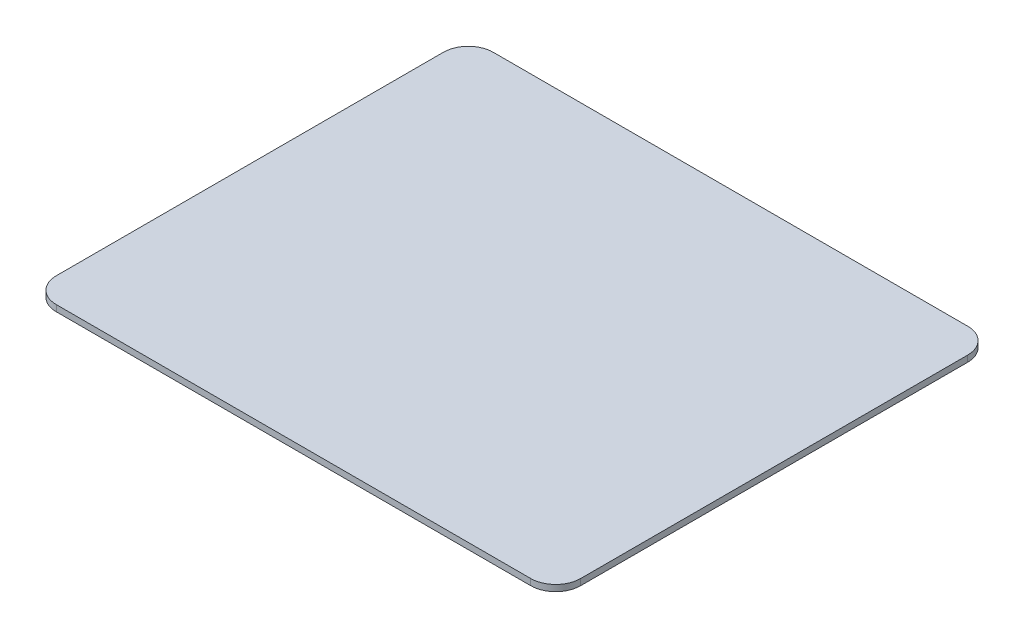
ISO-10303-21;
HEADER;
FILE_DESCRIPTION(('STEP AP214'),'2;1');
FILE_NAME('part.step','',(''),(''),'','','');
FILE_SCHEMA(('AUTOMOTIVE_DESIGN { 1 0 10303 214 1 1 1 1 }'));
ENDSEC;
DATA;
#1=APPLICATION_CONTEXT('core data for automotive mechanical design processes');
#2=APPLICATION_PROTOCOL_DEFINITION('international standard','automotive_design',2000,#1);
#3=PRODUCT_CONTEXT('',#1,'mechanical');
#4=PRODUCT('Part','Part','',(#3));
#5=PRODUCT_RELATED_PRODUCT_CATEGORY('part','',(#4));
#6=PRODUCT_DEFINITION_FORMATION('','',#4);
#7=PRODUCT_DEFINITION_CONTEXT('part definition',#1,'design');
#8=PRODUCT_DEFINITION('design','',#6,#7);
#9=PRODUCT_DEFINITION_SHAPE('','',#8);
#10=(LENGTH_UNIT() NAMED_UNIT(*) SI_UNIT(.MILLI.,.METRE.));
#11=(NAMED_UNIT(*) PLANE_ANGLE_UNIT() SI_UNIT($,.RADIAN.));
#12=(NAMED_UNIT(*) SI_UNIT($,.STERADIAN.) SOLID_ANGLE_UNIT());
#13=UNCERTAINTY_MEASURE_WITH_UNIT(LENGTH_MEASURE(1.E-05),#10,'distance_accuracy_value','');
#14=(GEOMETRIC_REPRESENTATION_CONTEXT(3) GLOBAL_UNCERTAINTY_ASSIGNED_CONTEXT((#13)) GLOBAL_UNIT_ASSIGNED_CONTEXT((#10,
#11,#12)) REPRESENTATION_CONTEXT('',''));
#15=CARTESIAN_POINT('',(0.,0.,0.));
#16=DIRECTION('',(0.,0.,1.));
#17=DIRECTION('',(1.,0.,0.));
#18=AXIS2_PLACEMENT_3D('',#15,#16,#17);
#19=CARTESIAN_POINT('',(210.,5.,175.));
#20=DIRECTION('',(-1.,0.,0.));
#21=DIRECTION('',(0.,0.,1.));
#22=AXIS2_PLACEMENT_3D('',#19,#20,#21);
#23=PLANE('',#22);
#24=DIRECTION('',(0.,0.,-1.));
#25=VECTOR('',#24,1.);
#26=CARTESIAN_POINT('',(210.,5.,175.));
#27=LINE('',#26,#25);
#28=CARTESIAN_POINT('',(210.,5.,155.));
#29=VERTEX_POINT('',#28);
#30=CARTESIAN_POINT('',(210.,5.,-155.));
#31=VERTEX_POINT('',#30);
#32=EDGE_CURVE('E122',#29,#31,#27,.T.);
#33=ORIENTED_EDGE('',*,*,#32,.F.);
#34=DIRECTION('',(0.,-1.,0.));
#35=VECTOR('',#34,1.);
#36=CARTESIAN_POINT('',(210.,5.,155.));
#37=LINE('',#36,#35);
#38=CARTESIAN_POINT('',(210.,0.,155.));
#39=VERTEX_POINT('',#38);
#40=EDGE_CURVE('E107',#29,#39,#37,.T.);
#41=ORIENTED_EDGE('',*,*,#40,.T.);
#42=DIRECTION('',(0.,0.,-1.));
#43=VECTOR('',#42,1.);
#44=CARTESIAN_POINT('',(210.,0.,175.));
#45=LINE('',#44,#43);
#46=CARTESIAN_POINT('',(210.,0.,-155.));
#47=VERTEX_POINT('',#46);
#48=EDGE_CURVE('E119',#39,#47,#45,.T.);
#49=ORIENTED_EDGE('',*,*,#48,.T.);
#50=DIRECTION('',(0.,-1.,0.));
#51=VECTOR('',#50,1.);
#52=CARTESIAN_POINT('',(210.,5.,-155.));
#53=LINE('',#52,#51);
#54=EDGE_CURVE('E124',#47,#31,#53,.F.);
#55=ORIENTED_EDGE('',*,*,#54,.T.);
#56=EDGE_LOOP('',(#33,#41,#49,#55));
#57=FACE_BOUND('',#56,.T.);
#58=ADVANCED_FACE('F37',(#57),#23,.F.);
#59=CARTESIAN_POINT('',(-210.,5.,-175.));
#60=DIRECTION('',(0.,0.,1.));
#61=DIRECTION('',(1.,0.,0.));
#62=AXIS2_PLACEMENT_3D('',#59,#60,#61);
#63=PLANE('',#62);
#64=DIRECTION('',(-1.,0.,0.));
#65=VECTOR('',#64,1.);
#66=CARTESIAN_POINT('',(-210.,5.,-175.));
#67=LINE('',#66,#65);
#68=CARTESIAN_POINT('',(190.,5.,-175.));
#69=VERTEX_POINT('',#68);
#70=CARTESIAN_POINT('',(-190.,5.,-175.));
#71=VERTEX_POINT('',#70);
#72=EDGE_CURVE('E164',#69,#71,#67,.T.);
#73=ORIENTED_EDGE('',*,*,#72,.F.);
#74=DIRECTION('',(0.,-1.,0.));
#75=VECTOR('',#74,1.);
#76=CARTESIAN_POINT('',(190.,5.,-175.));
#77=LINE('',#76,#75);
#78=CARTESIAN_POINT('',(190.,0.,-175.));
#79=VERTEX_POINT('',#78);
#80=EDGE_CURVE('E157',#69,#79,#77,.T.);
#81=ORIENTED_EDGE('',*,*,#80,.T.);
#82=DIRECTION('',(-1.,0.,0.));
#83=VECTOR('',#82,1.);
#84=CARTESIAN_POINT('',(-210.,0.,-175.));
#85=LINE('',#84,#83);
#86=CARTESIAN_POINT('',(-190.,0.,-175.));
#87=VERTEX_POINT('',#86);
#88=EDGE_CURVE('E128',#79,#87,#85,.T.);
#89=ORIENTED_EDGE('',*,*,#88,.T.);
#90=DIRECTION('',(0.,-1.,0.));
#91=VECTOR('',#90,1.);
#92=CARTESIAN_POINT('',(-190.,5.,-175.));
#93=LINE('',#92,#91);
#94=EDGE_CURVE('E155',#87,#71,#93,.F.);
#95=ORIENTED_EDGE('',*,*,#94,.T.);
#96=EDGE_LOOP('',(#73,#81,#89,#95));
#97=FACE_BOUND('',#96,.T.);
#98=ADVANCED_FACE('F162',(#97),#63,.F.);
#99=CARTESIAN_POINT('',(-210.,5.,175.));
#100=DIRECTION('',(1.,0.,0.));
#101=DIRECTION('',(0.,0.,-1.));
#102=AXIS2_PLACEMENT_3D('',#99,#100,#101);
#103=PLANE('',#102);
#104=DIRECTION('',(0.,0.,1.));
#105=VECTOR('',#104,1.);
#106=CARTESIAN_POINT('',(-210.,5.,175.));
#107=LINE('',#106,#105);
#108=CARTESIAN_POINT('',(-210.,5.,-155.));
#109=VERTEX_POINT('',#108);
#110=CARTESIAN_POINT('',(-210.,5.,155.));
#111=VERTEX_POINT('',#110);
#112=EDGE_CURVE('E172',#109,#111,#107,.T.);
#113=ORIENTED_EDGE('',*,*,#112,.F.);
#114=DIRECTION('',(0.,-1.,0.));
#115=VECTOR('',#114,1.);
#116=CARTESIAN_POINT('',(-210.,5.,-155.));
#117=LINE('',#116,#115);
#118=CARTESIAN_POINT('',(-210.,0.,-155.));
#119=VERTEX_POINT('',#118);
#120=EDGE_CURVE('E11',#109,#119,#117,.T.);
#121=ORIENTED_EDGE('',*,*,#120,.T.);
#122=DIRECTION('',(0.,0.,1.));
#123=VECTOR('',#122,1.);
#124=CARTESIAN_POINT('',(-210.,0.,175.));
#125=LINE('',#124,#123);
#126=CARTESIAN_POINT('',(-210.,0.,155.));
#127=VERTEX_POINT('',#126);
#128=EDGE_CURVE('E131',#119,#127,#125,.T.);
#129=ORIENTED_EDGE('',*,*,#128,.T.);
#130=DIRECTION('',(0.,-1.,0.));
#131=VECTOR('',#130,1.);
#132=CARTESIAN_POINT('',(-210.,5.,155.));
#133=LINE('',#132,#131);
#134=EDGE_CURVE('E45',#127,#111,#133,.F.);
#135=ORIENTED_EDGE('',*,*,#134,.T.);
#136=EDGE_LOOP('',(#113,#121,#129,#135));
#137=FACE_BOUND('',#136,.T.);
#138=ADVANCED_FACE('F171',(#137),#103,.F.);
#139=CARTESIAN_POINT('',(-210.,5.,175.));
#140=DIRECTION('',(0.,0.,-1.));
#141=DIRECTION('',(-1.,0.,0.));
#142=AXIS2_PLACEMENT_3D('',#139,#140,#141);
#143=PLANE('',#142);
#144=DIRECTION('',(1.,0.,0.));
#145=VECTOR('',#144,1.);
#146=CARTESIAN_POINT('',(-210.,0.,175.));
#147=LINE('',#146,#145);
#148=CARTESIAN_POINT('',(-190.,0.,175.));
#149=VERTEX_POINT('',#148);
#150=CARTESIAN_POINT('',(190.,0.,175.));
#151=VERTEX_POINT('',#150);
#152=EDGE_CURVE('E138',#149,#151,#147,.T.);
#153=ORIENTED_EDGE('',*,*,#152,.T.);
#154=DIRECTION('',(0.,-1.,0.));
#155=VECTOR('',#154,1.);
#156=CARTESIAN_POINT('',(190.,5.,175.));
#157=LINE('',#156,#155);
#158=CARTESIAN_POINT('',(190.,5.,175.));
#159=VERTEX_POINT('',#158);
#160=EDGE_CURVE('E108',#151,#159,#157,.F.);
#161=ORIENTED_EDGE('',*,*,#160,.T.);
#162=DIRECTION('',(1.,0.,0.));
#163=VECTOR('',#162,1.);
#164=CARTESIAN_POINT('',(-210.,5.,175.));
#165=LINE('',#164,#163);
#166=CARTESIAN_POINT('',(-190.,5.,175.));
#167=VERTEX_POINT('',#166);
#168=EDGE_CURVE('E134',#167,#159,#165,.T.);
#169=ORIENTED_EDGE('',*,*,#168,.F.);
#170=DIRECTION('',(0.,-1.,0.));
#171=VECTOR('',#170,1.);
#172=CARTESIAN_POINT('',(-190.,5.,175.));
#173=LINE('',#172,#171);
#174=EDGE_CURVE('E113',#167,#149,#173,.T.);
#175=ORIENTED_EDGE('',*,*,#174,.T.);
#176=EDGE_LOOP('',(#153,#161,#169,#175));
#177=FACE_BOUND('',#176,.T.);
#178=ADVANCED_FACE('F195',(#177),#143,.F.);
#179=CARTESIAN_POINT('',(0.,5.,0.));
#180=DIRECTION('',(0.,-1.,0.));
#181=DIRECTION('',(0.,0.,-1.));
#182=AXIS2_PLACEMENT_3D('',#179,#180,#181);
#183=PLANE('',#182);
#184=ORIENTED_EDGE('',*,*,#168,.T.);
#185=CARTESIAN_POINT('',(190.,5.,155.));
#186=DIRECTION('',(0.,-1.,0.));
#187=DIRECTION('',(0.,0.,-1.));
#188=AXIS2_PLACEMENT_3D('',#185,#186,#187);
#189=CIRCLE('',#188,20.);
#190=EDGE_CURVE('E153',#159,#29,#189,.F.);
#191=ORIENTED_EDGE('',*,*,#190,.T.);
#192=ORIENTED_EDGE('',*,*,#32,.T.);
#193=CARTESIAN_POINT('',(190.,5.,-155.));
#194=DIRECTION('',(0.,-1.,0.));
#195=DIRECTION('',(0.,0.,-1.));
#196=AXIS2_PLACEMENT_3D('',#193,#194,#195);
#197=CIRCLE('',#196,20.);
#198=EDGE_CURVE('E151',#31,#69,#197,.F.);
#199=ORIENTED_EDGE('',*,*,#198,.T.);
#200=ORIENTED_EDGE('',*,*,#72,.T.);
#201=CARTESIAN_POINT('',(-190.,5.,-155.));
#202=DIRECTION('',(0.,-1.,0.));
#203=DIRECTION('',(0.,0.,-1.));
#204=AXIS2_PLACEMENT_3D('',#201,#202,#203);
#205=CIRCLE('',#204,20.);
#206=EDGE_CURVE('E58',#71,#109,#205,.F.);
#207=ORIENTED_EDGE('',*,*,#206,.T.);
#208=ORIENTED_EDGE('',*,*,#112,.T.);
#209=CARTESIAN_POINT('',(-190.,5.,155.));
#210=DIRECTION('',(0.,-1.,0.));
#211=DIRECTION('',(0.,0.,-1.));
#212=AXIS2_PLACEMENT_3D('',#209,#210,#211);
#213=CIRCLE('',#212,20.);
#214=EDGE_CURVE('E148',#111,#167,#213,.F.);
#215=ORIENTED_EDGE('',*,*,#214,.T.);
#216=EDGE_LOOP('',(#184,#191,#192,#199,#200,#207,#208,#215));
#217=FACE_BOUND('',#216,.T.);
#218=ADVANCED_FACE('F177',(#217),#183,.F.);
#219=CARTESIAN_POINT('',(0.,0.,0.));
#220=DIRECTION('',(0.,-1.,0.));
#221=DIRECTION('',(0.,0.,-1.));
#222=AXIS2_PLACEMENT_3D('',#219,#220,#221);
#223=PLANE('',#222);
#224=ORIENTED_EDGE('',*,*,#48,.F.);
#225=CARTESIAN_POINT('',(190.,0.,155.));
#226=DIRECTION('',(0.,-1.,0.));
#227=DIRECTION('',(0.,0.,-1.));
#228=AXIS2_PLACEMENT_3D('',#225,#226,#227);
#229=CIRCLE('',#228,20.);
#230=EDGE_CURVE('E103',#39,#151,#229,.T.);
#231=ORIENTED_EDGE('',*,*,#230,.T.);
#232=ORIENTED_EDGE('',*,*,#152,.F.);
#233=CARTESIAN_POINT('',(-190.,0.,155.));
#234=DIRECTION('',(0.,-1.,0.));
#235=DIRECTION('',(0.,0.,-1.));
#236=AXIS2_PLACEMENT_3D('',#233,#234,#235);
#237=CIRCLE('',#236,20.);
#238=EDGE_CURVE('E123',#149,#127,#237,.T.);
#239=ORIENTED_EDGE('',*,*,#238,.T.);
#240=ORIENTED_EDGE('',*,*,#128,.F.);
#241=CARTESIAN_POINT('',(-190.,0.,-155.));
#242=DIRECTION('',(0.,-1.,0.));
#243=DIRECTION('',(0.,0.,-1.));
#244=AXIS2_PLACEMENT_3D('',#241,#242,#243);
#245=CIRCLE('',#244,20.);
#246=EDGE_CURVE('E142',#119,#87,#245,.T.);
#247=ORIENTED_EDGE('',*,*,#246,.T.);
#248=ORIENTED_EDGE('',*,*,#88,.F.);
#249=CARTESIAN_POINT('',(190.,0.,-155.));
#250=DIRECTION('',(0.,-1.,0.));
#251=DIRECTION('',(0.,0.,-1.));
#252=AXIS2_PLACEMENT_3D('',#249,#250,#251);
#253=CIRCLE('',#252,20.);
#254=EDGE_CURVE('E114',#79,#47,#253,.T.);
#255=ORIENTED_EDGE('',*,*,#254,.T.);
#256=EDGE_LOOP('',(#224,#231,#232,#239,#240,#247,#248,#255));
#257=FACE_BOUND('',#256,.T.);
#258=ADVANCED_FACE('F126',(#257),#223,.T.);
#259=CARTESIAN_POINT('',(190.,5.,155.));
#260=DIRECTION('',(0.,-1.,0.));
#261=DIRECTION('',(0.,0.,-1.));
#262=AXIS2_PLACEMENT_3D('',#259,#260,#261);
#263=CYLINDRICAL_SURFACE('',#262,20.);
#264=ORIENTED_EDGE('',*,*,#190,.F.);
#265=ORIENTED_EDGE('',*,*,#160,.F.);
#266=ORIENTED_EDGE('',*,*,#230,.F.);
#267=ORIENTED_EDGE('',*,*,#40,.F.);
#268=EDGE_LOOP('',(#264,#265,#266,#267));
#269=FACE_BOUND('',#268,.T.);
#270=ADVANCED_FACE('F106',(#269),#263,.T.);
#271=CARTESIAN_POINT('',(190.,5.,-155.));
#272=DIRECTION('',(0.,-1.,0.));
#273=DIRECTION('',(0.,0.,-1.));
#274=AXIS2_PLACEMENT_3D('',#271,#272,#273);
#275=CYLINDRICAL_SURFACE('',#274,20.);
#276=ORIENTED_EDGE('',*,*,#198,.F.);
#277=ORIENTED_EDGE('',*,*,#54,.F.);
#278=ORIENTED_EDGE('',*,*,#254,.F.);
#279=ORIENTED_EDGE('',*,*,#80,.F.);
#280=EDGE_LOOP('',(#276,#277,#278,#279));
#281=FACE_BOUND('',#280,.T.);
#282=ADVANCED_FACE('F178',(#281),#275,.T.);
#283=CARTESIAN_POINT('',(-190.,5.,-155.));
#284=DIRECTION('',(0.,-1.,0.));
#285=DIRECTION('',(0.,0.,-1.));
#286=AXIS2_PLACEMENT_3D('',#283,#284,#285);
#287=CYLINDRICAL_SURFACE('',#286,20.);
#288=ORIENTED_EDGE('',*,*,#206,.F.);
#289=ORIENTED_EDGE('',*,*,#94,.F.);
#290=ORIENTED_EDGE('',*,*,#246,.F.);
#291=ORIENTED_EDGE('',*,*,#120,.F.);
#292=EDGE_LOOP('',(#288,#289,#290,#291));
#293=FACE_BOUND('',#292,.T.);
#294=ADVANCED_FACE('F170',(#293),#287,.T.);
#295=CARTESIAN_POINT('',(-190.,5.,155.));
#296=DIRECTION('',(0.,-1.,0.));
#297=DIRECTION('',(0.,0.,-1.));
#298=AXIS2_PLACEMENT_3D('',#295,#296,#297);
#299=CYLINDRICAL_SURFACE('',#298,20.);
#300=ORIENTED_EDGE('',*,*,#214,.F.);
#301=ORIENTED_EDGE('',*,*,#134,.F.);
#302=ORIENTED_EDGE('',*,*,#238,.F.);
#303=ORIENTED_EDGE('',*,*,#174,.F.);
#304=EDGE_LOOP('',(#300,#301,#302,#303));
#305=FACE_BOUND('',#304,.T.);
#306=ADVANCED_FACE('F39',(#305),#299,.T.);
#307=CLOSED_SHELL('',(#58,#98,#138,#178,#218,#258,#270,#282,#294,#306));
#308=MANIFOLD_SOLID_BREP('B2',#307);
#309=ADVANCED_BREP_SHAPE_REPRESENTATION('',(#18,#308),#14);
#310=SHAPE_DEFINITION_REPRESENTATION(#9,#309);
ENDSEC;
END-ISO-10303-21;
